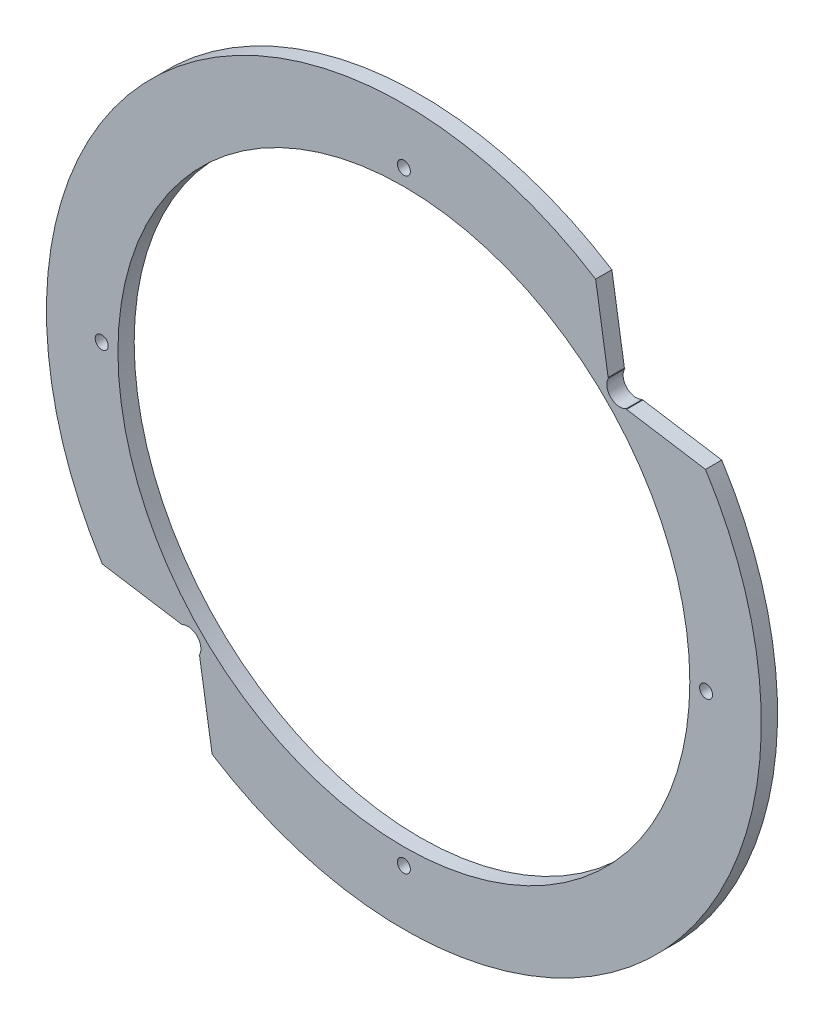
ISO-10303-21;
HEADER;
FILE_DESCRIPTION(('STEP AP214'),'2;1');
FILE_NAME('part.step','',(''),(''),'','','');
FILE_SCHEMA(('AUTOMOTIVE_DESIGN { 1 0 10303 214 1 1 1 1 }'));
ENDSEC;
DATA;
#1=APPLICATION_CONTEXT('core data for automotive mechanical design processes');
#2=APPLICATION_PROTOCOL_DEFINITION('international standard','automotive_design',2000,#1);
#3=PRODUCT_CONTEXT('',#1,'mechanical');
#4=PRODUCT('Part','Part','',(#3));
#5=PRODUCT_RELATED_PRODUCT_CATEGORY('part','',(#4));
#6=PRODUCT_DEFINITION_FORMATION('','',#4);
#7=PRODUCT_DEFINITION_CONTEXT('part definition',#1,'design');
#8=PRODUCT_DEFINITION('design','',#6,#7);
#9=PRODUCT_DEFINITION_SHAPE('','',#8);
#10=(LENGTH_UNIT() NAMED_UNIT(*) SI_UNIT(.MILLI.,.METRE.));
#11=(NAMED_UNIT(*) PLANE_ANGLE_UNIT() SI_UNIT($,.RADIAN.));
#12=(NAMED_UNIT(*) SI_UNIT($,.STERADIAN.) SOLID_ANGLE_UNIT());
#13=UNCERTAINTY_MEASURE_WITH_UNIT(LENGTH_MEASURE(1.E-05),#10,'distance_accuracy_value','');
#14=(GEOMETRIC_REPRESENTATION_CONTEXT(3) GLOBAL_UNCERTAINTY_ASSIGNED_CONTEXT((#13)) GLOBAL_UNIT_ASSIGNED_CONTEXT((#10,
#11,#12)) REPRESENTATION_CONTEXT('',''));
#15=CARTESIAN_POINT('',(0.,0.,0.));
#16=DIRECTION('',(0.,0.,1.));
#17=DIRECTION('',(1.,0.,0.));
#18=AXIS2_PLACEMENT_3D('',#15,#16,#17);
#19=CARTESIAN_POINT('',(-8.54872034122459,-3.36544415628814,3.175));
#20=DIRECTION('',(0.,0.,-1.));
#21=DIRECTION('',(-1.,0.,0.));
#22=AXIS2_PLACEMENT_3D('',#19,#20,#21);
#23=CYLINDRICAL_SURFACE('',#22,69.85);
#24=CARTESIAN_POINT('',(-8.54872034122459,-3.36544415628814,3.175));
#25=DIRECTION('',(0.,0.,1.));
#26=DIRECTION('',(1.,0.,0.));
#27=AXIS2_PLACEMENT_3D('',#24,#25,#26);
#28=CIRCLE('',#27,69.85);
#29=CARTESIAN_POINT('',(-46.0242759515112,-62.3112262929289,3.175));
#30=VERTEX_POINT('',#29);
#31=CARTESIAN_POINT('',(50.3970617954156,34.1101114539994,3.175));
#32=VERTEX_POINT('',#31);
#33=EDGE_CURVE('E44',#30,#32,#28,.T.);
#34=ORIENTED_EDGE('',*,*,#33,.F.);
#35=DIRECTION('',(0.,0.,-1.));
#36=VECTOR('',#35,1.);
#37=CARTESIAN_POINT('',(-46.0242759515112,-62.3112262929289,3.175));
#38=LINE('',#37,#36);
#39=CARTESIAN_POINT('',(-46.0242759515112,-62.3112262929289,0.));
#40=VERTEX_POINT('',#39);
#41=EDGE_CURVE('E166',#30,#40,#38,.T.);
#42=ORIENTED_EDGE('',*,*,#41,.T.);
#43=CARTESIAN_POINT('',(-8.54872034122459,-3.36544415628814,0.));
#44=DIRECTION('',(0.,0.,1.));
#45=DIRECTION('',(1.,0.,0.));
#46=AXIS2_PLACEMENT_3D('',#43,#44,#45);
#47=CIRCLE('',#46,69.85);
#48=CARTESIAN_POINT('',(50.3970617954156,34.1101114539994,0.));
#49=VERTEX_POINT('',#48);
#50=EDGE_CURVE('E60',#40,#49,#47,.T.);
#51=ORIENTED_EDGE('',*,*,#50,.T.);
#52=DIRECTION('',(0.,0.,-1.));
#53=VECTOR('',#52,1.);
#54=CARTESIAN_POINT('',(50.3970617954156,34.1101114539994,3.175));
#55=LINE('',#54,#53);
#56=EDGE_CURVE('E154',#32,#49,#55,.T.);
#57=ORIENTED_EDGE('',*,*,#56,.F.);
#58=EDGE_LOOP('',(#34,#42,#51,#57));
#59=FACE_BOUND('',#58,.T.);
#60=ADVANCED_FACE('F35',(#59),#23,.T.);
#61=CARTESIAN_POINT('',(-8.54872034122459,-3.36544415628814,3.175));
#62=DIRECTION('',(0.,0.,-1.));
#63=DIRECTION('',(-1.,0.,0.));
#64=AXIS2_PLACEMENT_3D('',#61,#62,#63);
#65=CYLINDRICAL_SURFACE('',#64,55.88);
#66=CARTESIAN_POINT('',(-8.54872034122459,-3.36544415628814,3.175));
#67=DIRECTION('',(0.,0.,1.));
#68=DIRECTION('',(1.,0.,0.));
#69=AXIS2_PLACEMENT_3D('',#66,#67,#68);
#70=CIRCLE('',#69,55.88);
#71=CARTESIAN_POINT('',(47.3312796587754,-3.36544415628814,3.175));
#72=VERTEX_POINT('',#71);
#73=EDGE_CURVE('E212',#72,#72,#70,.T.);
#74=ORIENTED_EDGE('',*,*,#73,.T.);
#75=EDGE_LOOP('',(#74));
#76=FACE_BOUND('',#75,.T.);
#77=CARTESIAN_POINT('',(-8.54872034122459,-3.36544415628814,0.));
#78=DIRECTION('',(0.,0.,1.));
#79=DIRECTION('',(1.,0.,0.));
#80=AXIS2_PLACEMENT_3D('',#77,#78,#79);
#81=CIRCLE('',#80,55.88);
#82=CARTESIAN_POINT('',(47.3312796587754,-3.36544415628814,0.));
#83=VERTEX_POINT('',#82);
#84=EDGE_CURVE('E209',#83,#83,#81,.T.);
#85=ORIENTED_EDGE('',*,*,#84,.F.);
#86=EDGE_LOOP('',(#85));
#87=FACE_BOUND('',#86,.T.);
#88=ADVANCED_FACE('F37',(#76,#87),#65,.F.);
#89=CARTESIAN_POINT('',(28.9268352690623,55.5803379803524,0.));
#90=VERTEX_POINT('',#89);
#91=CARTESIAN_POINT('',(-67.4945024778652,-40.840999766575,0.));
#92=VERTEX_POINT('',#91);
#93=EDGE_CURVE('E39',#90,#92,#47,.T.);
#94=ORIENTED_EDGE('',*,*,#93,.T.);
#95=DIRECTION('',(0.,0.,-1.));
#96=VECTOR('',#95,1.);
#97=CARTESIAN_POINT('',(-67.4945024778652,-40.840999766575,3.175));
#98=LINE('',#97,#96);
#99=CARTESIAN_POINT('',(-67.4945024778652,-40.840999766575,3.175));
#100=VERTEX_POINT('',#99);
#101=EDGE_CURVE('E52',#100,#92,#98,.T.);
#102=ORIENTED_EDGE('',*,*,#101,.F.);
#103=CARTESIAN_POINT('',(28.9268352690623,55.5803379803524,3.175));
#104=VERTEX_POINT('',#103);
#105=EDGE_CURVE('E11',#104,#100,#28,.T.);
#106=ORIENTED_EDGE('',*,*,#105,.F.);
#107=DIRECTION('',(0.,0.,-1.));
#108=VECTOR('',#107,1.);
#109=CARTESIAN_POINT('',(28.9268352690623,55.5803379803524,3.175));
#110=LINE('',#109,#108);
#111=EDGE_CURVE('E178',#104,#90,#110,.T.);
#112=ORIENTED_EDGE('',*,*,#111,.T.);
#113=EDGE_LOOP('',(#94,#102,#106,#112));
#114=FACE_BOUND('',#113,.T.);
#115=ADVANCED_FACE('F139',(#114),#23,.T.);
#116=CARTESIAN_POINT('',(0.,0.,3.175));
#117=DIRECTION('',(0.,0.,1.));
#118=DIRECTION('',(1.,0.,0.));
#119=AXIS2_PLACEMENT_3D('',#116,#117,#118);
#120=PLANE('',#119);
#121=DIRECTION('',(0.156434465040236,-0.987688340595137,0.));
#122=VECTOR('',#121,1.);
#123=CARTESIAN_POINT('',(-54.5255956839104,-8.6360059557584,3.175));
#124=LINE('',#123,#122);
#125=CARTESIAN_POINT('',(-48.4674898991949,-46.8853805300659,3.175));
#126=VERTEX_POINT('',#125);
#127=EDGE_CURVE('E142',#126,#30,#124,.T.);
#128=ORIENTED_EDGE('',*,*,#127,.T.);
#129=ORIENTED_EDGE('',*,*,#33,.T.);
#130=DIRECTION('',(-0.987688340595139,0.156434465040225,0.));
#131=VECTOR('',#130,1.);
#132=CARTESIAN_POINT('',(6.50360594603244,41.0621518926134,3.175));
#133=LINE('',#132,#131);
#134=CARTESIAN_POINT('',(34.9712160325524,36.553325401683,3.175));
#135=VERTEX_POINT('',#134);
#136=EDGE_CURVE('E177',#32,#135,#133,.T.);
#137=ORIENTED_EDGE('',*,*,#136,.T.);
#138=CARTESIAN_POINT('',(-8.54872034122459,-3.36544415628814,3.175));
#139=DIRECTION('',(0.,0.,-1.));
#140=DIRECTION('',(-1.,0.,0.));
#141=AXIS2_PLACEMENT_3D('',#138,#139,#140);
#142=CIRCLE('',#141,59.055);
#143=CARTESIAN_POINT('',(34.9030183787262,36.6275480700149,3.175));
#144=VERTEX_POINT('',#143);
#145=EDGE_CURVE('E306',#144,#135,#142,.T.);
#146=ORIENTED_EDGE('',*,*,#145,.F.);
#147=CARTESIAN_POINT('',(33.6584834278004,38.8417596127373,3.175));
#148=DIRECTION('',(0.,0.,-1.));
#149=DIRECTION('',(-1.,0.,0.));
#150=AXIS2_PLACEMENT_3D('',#147,#148,#149);
#151=CIRCLE('',#150,2.54000000000013);
#152=CARTESIAN_POINT('',(31.444271885078,40.086294563663,3.175));
#153=VERTEX_POINT('',#152);
#154=EDGE_CURVE('E158',#144,#153,#151,.T.);
#155=ORIENTED_EDGE('',*,*,#154,.T.);
#156=CARTESIAN_POINT('',(-8.54872034122459,-3.36544415628814,3.175));
#157=DIRECTION('',(0.,0.,-1.));
#158=DIRECTION('',(-1.,0.,0.));
#159=AXIS2_PLACEMENT_3D('',#156,#157,#158);
#160=CIRCLE('',#159,59.055);
#161=CARTESIAN_POINT('',(31.3700492167461,40.1544922174892,3.175));
#162=VERTEX_POINT('',#161);
#163=EDGE_CURVE('E152',#162,#153,#160,.T.);
#164=ORIENTED_EDGE('',*,*,#163,.F.);
#165=DIRECTION('',(-0.156434465040236,0.987688340595137,0.));
#166=VECTOR('',#165,1.);
#167=CARTESIAN_POINT('',(36.8065797182666,5.82958952893829,3.175));
#168=LINE('',#167,#166);
#169=EDGE_CURVE('E150',#162,#104,#168,.T.);
#170=ORIENTED_EDGE('',*,*,#169,.T.);
#171=ORIENTED_EDGE('',*,*,#105,.T.);
#172=DIRECTION('',(0.987688340595139,-0.156434465040226,0.));
#173=VECTOR('',#172,1.);
#174=CARTESIAN_POINT('',(-7.96198953866322,-50.2700235095634,3.175));
#175=LINE('',#174,#173);
#176=CARTESIAN_POINT('',(-52.0686567150023,-43.2842137142585,3.175));
#177=VERTEX_POINT('',#176);
#178=EDGE_CURVE('E128',#100,#177,#175,.T.);
#179=ORIENTED_EDGE('',*,*,#178,.T.);
#180=CARTESIAN_POINT('',(-8.54872034122459,-3.36544415628814,3.175));
#181=DIRECTION('',(0.,0.,-1.));
#182=DIRECTION('',(-1.,0.,0.));
#183=AXIS2_PLACEMENT_3D('',#180,#181,#182);
#184=CIRCLE('',#183,59.055);
#185=CARTESIAN_POINT('',(-52.0004590611755,-43.358436382591,3.175));
#186=VERTEX_POINT('',#185);
#187=EDGE_CURVE('E133',#186,#177,#184,.T.);
#188=ORIENTED_EDGE('',*,*,#187,.F.);
#189=CARTESIAN_POINT('',(-50.7559241102495,-45.5726479253132,3.175));
#190=DIRECTION('',(0.,0.,-1.));
#191=DIRECTION('',(-1.,0.,0.));
#192=AXIS2_PLACEMENT_3D('',#189,#190,#191);
#193=CIRCLE('',#192,2.54);
#194=CARTESIAN_POINT('',(-48.5417125675273,-46.8171828762392,3.175));
#195=VERTEX_POINT('',#194);
#196=EDGE_CURVE('E334',#186,#195,#193,.T.);
#197=ORIENTED_EDGE('',*,*,#196,.T.);
#198=CARTESIAN_POINT('',(-8.54872034122459,-3.36544415628814,3.175));
#199=DIRECTION('',(0.,0.,-1.));
#200=DIRECTION('',(-1.,0.,0.));
#201=AXIS2_PLACEMENT_3D('',#198,#199,#200);
#202=CIRCLE('',#201,59.055);
#203=EDGE_CURVE('E336',#126,#195,#202,.T.);
#204=ORIENTED_EDGE('',*,*,#203,.F.);
#205=EDGE_LOOP('',(#128,#129,#137,#146,#155,#164,#170,#171,#179,#188,#197,#204));
#206=FACE_BOUND('',#205,.T.);
#207=CARTESIAN_POINT('',(-67.6037203412246,-3.36544415628814,3.175));
#208=DIRECTION('',(0.,0.,-1.));
#209=DIRECTION('',(-1.,0.,0.));
#210=AXIS2_PLACEMENT_3D('',#207,#208,#209);
#211=CIRCLE('',#210,1.26999999999999);
#212=CARTESIAN_POINT('',(-68.8737203412246,-3.36544415628814,3.175));
#213=VERTEX_POINT('',#212);
#214=EDGE_CURVE('E188',#213,#213,#211,.T.);
#215=ORIENTED_EDGE('',*,*,#214,.T.);
#216=EDGE_LOOP('',(#215));
#217=FACE_BOUND('',#216,.T.);
#218=CARTESIAN_POINT('',(-8.5487203412246,-62.4204441562881,3.175));
#219=DIRECTION('',(0.,0.,-1.));
#220=DIRECTION('',(-1.,0.,0.));
#221=AXIS2_PLACEMENT_3D('',#218,#219,#220);
#222=CIRCLE('',#221,1.27);
#223=CARTESIAN_POINT('',(-9.8187203412246,-62.4204441562881,3.175));
#224=VERTEX_POINT('',#223);
#225=EDGE_CURVE('E194',#224,#224,#222,.T.);
#226=ORIENTED_EDGE('',*,*,#225,.T.);
#227=EDGE_LOOP('',(#226));
#228=FACE_BOUND('',#227,.T.);
#229=CARTESIAN_POINT('',(50.5062796587754,-3.36544415628814,3.175));
#230=DIRECTION('',(0.,0.,-1.));
#231=DIRECTION('',(-1.,0.,0.));
#232=AXIS2_PLACEMENT_3D('',#229,#230,#231);
#233=CIRCLE('',#232,1.27);
#234=CARTESIAN_POINT('',(49.2362796587754,-3.36544415628814,3.175));
#235=VERTEX_POINT('',#234);
#236=EDGE_CURVE('E200',#235,#235,#233,.T.);
#237=ORIENTED_EDGE('',*,*,#236,.T.);
#238=EDGE_LOOP('',(#237));
#239=FACE_BOUND('',#238,.T.);
#240=CARTESIAN_POINT('',(-8.5487203412246,55.6895558437119,3.175));
#241=DIRECTION('',(0.,0.,-1.));
#242=DIRECTION('',(-1.,0.,0.));
#243=AXIS2_PLACEMENT_3D('',#240,#241,#242);
#244=CIRCLE('',#243,1.27);
#245=CARTESIAN_POINT('',(-9.8187203412246,55.6895558437119,3.175));
#246=VERTEX_POINT('',#245);
#247=EDGE_CURVE('E206',#246,#246,#244,.T.);
#248=ORIENTED_EDGE('',*,*,#247,.T.);
#249=EDGE_LOOP('',(#248));
#250=FACE_BOUND('',#249,.T.);
#251=ORIENTED_EDGE('',*,*,#73,.F.);
#252=EDGE_LOOP('',(#251));
#253=FACE_BOUND('',#252,.T.);
#254=ADVANCED_FACE('F146',(#206,#217,#228,#239,#250,#253),#120,.T.);
#255=CARTESIAN_POINT('',(0.,0.,0.));
#256=DIRECTION('',(0.,0.,1.));
#257=DIRECTION('',(1.,0.,0.));
#258=AXIS2_PLACEMENT_3D('',#255,#256,#257);
#259=PLANE('',#258);
#260=CARTESIAN_POINT('',(-67.6037203412246,-3.36544415628814,0.));
#261=DIRECTION('',(0.,0.,-1.));
#262=DIRECTION('',(-1.,0.,0.));
#263=AXIS2_PLACEMENT_3D('',#260,#261,#262);
#264=CIRCLE('',#263,1.26999999999999);
#265=CARTESIAN_POINT('',(-68.8737203412246,-3.36544415628814,0.));
#266=VERTEX_POINT('',#265);
#267=EDGE_CURVE('E180',#266,#266,#264,.T.);
#268=ORIENTED_EDGE('',*,*,#267,.F.);
#269=EDGE_LOOP('',(#268));
#270=FACE_BOUND('',#269,.T.);
#271=CARTESIAN_POINT('',(-8.5487203412246,-62.4204441562881,0.));
#272=DIRECTION('',(0.,0.,-1.));
#273=DIRECTION('',(-1.,0.,0.));
#274=AXIS2_PLACEMENT_3D('',#271,#272,#273);
#275=CIRCLE('',#274,1.27);
#276=CARTESIAN_POINT('',(-9.8187203412246,-62.4204441562881,0.));
#277=VERTEX_POINT('',#276);
#278=EDGE_CURVE('E191',#277,#277,#275,.T.);
#279=ORIENTED_EDGE('',*,*,#278,.F.);
#280=EDGE_LOOP('',(#279));
#281=FACE_BOUND('',#280,.T.);
#282=CARTESIAN_POINT('',(50.5062796587754,-3.36544415628814,0.));
#283=DIRECTION('',(0.,0.,-1.));
#284=DIRECTION('',(-1.,0.,0.));
#285=AXIS2_PLACEMENT_3D('',#282,#283,#284);
#286=CIRCLE('',#285,1.27);
#287=CARTESIAN_POINT('',(49.2362796587754,-3.36544415628814,0.));
#288=VERTEX_POINT('',#287);
#289=EDGE_CURVE('E197',#288,#288,#286,.T.);
#290=ORIENTED_EDGE('',*,*,#289,.F.);
#291=EDGE_LOOP('',(#290));
#292=FACE_BOUND('',#291,.T.);
#293=CARTESIAN_POINT('',(-8.5487203412246,55.6895558437119,0.));
#294=DIRECTION('',(0.,0.,-1.));
#295=DIRECTION('',(-1.,0.,0.));
#296=AXIS2_PLACEMENT_3D('',#293,#294,#295);
#297=CIRCLE('',#296,1.27);
#298=CARTESIAN_POINT('',(-9.8187203412246,55.6895558437119,0.));
#299=VERTEX_POINT('',#298);
#300=EDGE_CURVE('E203',#299,#299,#297,.T.);
#301=ORIENTED_EDGE('',*,*,#300,.F.);
#302=EDGE_LOOP('',(#301));
#303=FACE_BOUND('',#302,.T.);
#304=ORIENTED_EDGE('',*,*,#84,.T.);
#305=EDGE_LOOP('',(#304));
#306=FACE_BOUND('',#305,.T.);
#307=ORIENTED_EDGE('',*,*,#50,.F.);
#308=DIRECTION('',(0.156434465040236,-0.987688340595137,0.));
#309=VECTOR('',#308,1.);
#310=CARTESIAN_POINT('',(-54.5255956839104,-8.6360059557584,0.));
#311=LINE('',#310,#309);
#312=CARTESIAN_POINT('',(-48.4674898991949,-46.8853805300659,0.));
#313=VERTEX_POINT('',#312);
#314=EDGE_CURVE('E134',#313,#40,#311,.T.);
#315=ORIENTED_EDGE('',*,*,#314,.F.);
#316=CARTESIAN_POINT('',(-8.54872034122459,-3.36544415628814,0.));
#317=DIRECTION('',(0.,0.,-1.));
#318=DIRECTION('',(-1.,0.,0.));
#319=AXIS2_PLACEMENT_3D('',#316,#317,#318);
#320=CIRCLE('',#319,59.055);
#321=CARTESIAN_POINT('',(-48.5417125675273,-46.8171828762392,0.));
#322=VERTEX_POINT('',#321);
#323=EDGE_CURVE('E295',#313,#322,#320,.T.);
#324=ORIENTED_EDGE('',*,*,#323,.T.);
#325=CARTESIAN_POINT('',(-50.7559241102495,-45.5726479253132,0.));
#326=DIRECTION('',(0.,0.,-1.));
#327=DIRECTION('',(-1.,0.,0.));
#328=AXIS2_PLACEMENT_3D('',#325,#326,#327);
#329=CIRCLE('',#328,2.54);
#330=CARTESIAN_POINT('',(-52.0004590611755,-43.358436382591,0.));
#331=VERTEX_POINT('',#330);
#332=EDGE_CURVE('E320',#331,#322,#329,.T.);
#333=ORIENTED_EDGE('',*,*,#332,.F.);
#334=CARTESIAN_POINT('',(-8.54872034122459,-3.36544415628814,0.));
#335=DIRECTION('',(0.,0.,-1.));
#336=DIRECTION('',(-1.,0.,0.));
#337=AXIS2_PLACEMENT_3D('',#334,#335,#336);
#338=CIRCLE('',#337,59.055);
#339=CARTESIAN_POINT('',(-52.0686567150023,-43.2842137142585,0.));
#340=VERTEX_POINT('',#339);
#341=EDGE_CURVE('E318',#331,#340,#338,.T.);
#342=ORIENTED_EDGE('',*,*,#341,.T.);
#343=DIRECTION('',(0.987688340595139,-0.156434465040226,0.));
#344=VECTOR('',#343,1.);
#345=CARTESIAN_POINT('',(-7.96198953866322,-50.2700235095634,0.));
#346=LINE('',#345,#344);
#347=EDGE_CURVE('E315',#92,#340,#346,.T.);
#348=ORIENTED_EDGE('',*,*,#347,.F.);
#349=ORIENTED_EDGE('',*,*,#93,.F.);
#350=DIRECTION('',(-0.156434465040236,0.987688340595137,0.));
#351=VECTOR('',#350,1.);
#352=CARTESIAN_POINT('',(36.8065797182666,5.82958952893829,0.));
#353=LINE('',#352,#351);
#354=CARTESIAN_POINT('',(31.3700492167461,40.1544922174892,0.));
#355=VERTEX_POINT('',#354);
#356=EDGE_CURVE('E175',#355,#90,#353,.T.);
#357=ORIENTED_EDGE('',*,*,#356,.F.);
#358=CARTESIAN_POINT('',(-8.54872034122459,-3.36544415628814,0.));
#359=DIRECTION('',(0.,0.,-1.));
#360=DIRECTION('',(-1.,0.,0.));
#361=AXIS2_PLACEMENT_3D('',#358,#359,#360);
#362=CIRCLE('',#361,59.055);
#363=CARTESIAN_POINT('',(31.444271885078,40.086294563663,0.));
#364=VERTEX_POINT('',#363);
#365=EDGE_CURVE('E172',#355,#364,#362,.T.);
#366=ORIENTED_EDGE('',*,*,#365,.T.);
#367=CARTESIAN_POINT('',(33.6584834278004,38.8417596127373,0.));
#368=DIRECTION('',(0.,0.,-1.));
#369=DIRECTION('',(-1.,0.,0.));
#370=AXIS2_PLACEMENT_3D('',#367,#368,#369);
#371=CIRCLE('',#370,2.54000000000013);
#372=CARTESIAN_POINT('',(34.9030183787262,36.6275480700149,0.));
#373=VERTEX_POINT('',#372);
#374=EDGE_CURVE('E169',#373,#364,#371,.T.);
#375=ORIENTED_EDGE('',*,*,#374,.F.);
#376=CARTESIAN_POINT('',(-8.54872034122459,-3.36544415628814,0.));
#377=DIRECTION('',(0.,0.,-1.));
#378=DIRECTION('',(-1.,0.,0.));
#379=AXIS2_PLACEMENT_3D('',#376,#377,#378);
#380=CIRCLE('',#379,59.055);
#381=CARTESIAN_POINT('',(34.9712160325524,36.553325401683,0.));
#382=VERTEX_POINT('',#381);
#383=EDGE_CURVE('E165',#373,#382,#380,.T.);
#384=ORIENTED_EDGE('',*,*,#383,.T.);
#385=DIRECTION('',(-0.987688340595139,0.156434465040225,0.));
#386=VECTOR('',#385,1.);
#387=CARTESIAN_POINT('',(6.50360594603244,41.0621518926134,0.));
#388=LINE('',#387,#386);
#389=EDGE_CURVE('E162',#49,#382,#388,.T.);
#390=ORIENTED_EDGE('',*,*,#389,.F.);
#391=EDGE_LOOP('',(#307,#315,#324,#333,#342,#348,#349,#357,#366,#375,#384,#390));
#392=FACE_BOUND('',#391,.T.);
#393=ADVANCED_FACE('F217',(#270,#281,#292,#303,#306,#392),#259,.F.);
#394=CARTESIAN_POINT('',(-8.5487203412246,55.6895558437119,3.175));
#395=DIRECTION('',(0.,0.,-1.));
#396=DIRECTION('',(-1.,0.,0.));
#397=AXIS2_PLACEMENT_3D('',#394,#395,#396);
#398=CYLINDRICAL_SURFACE('',#397,1.27);
#399=ORIENTED_EDGE('',*,*,#247,.F.);
#400=EDGE_LOOP('',(#399));
#401=FACE_BOUND('',#400,.T.);
#402=ORIENTED_EDGE('',*,*,#300,.T.);
#403=EDGE_LOOP('',(#402));
#404=FACE_BOUND('',#403,.T.);
#405=ADVANCED_FACE('F233',(#401,#404),#398,.F.);
#406=CARTESIAN_POINT('',(50.5062796587754,-3.36544415628814,3.175));
#407=DIRECTION('',(0.,0.,-1.));
#408=DIRECTION('',(-1.,0.,0.));
#409=AXIS2_PLACEMENT_3D('',#406,#407,#408);
#410=CYLINDRICAL_SURFACE('',#409,1.27);
#411=ORIENTED_EDGE('',*,*,#236,.F.);
#412=EDGE_LOOP('',(#411));
#413=FACE_BOUND('',#412,.T.);
#414=ORIENTED_EDGE('',*,*,#289,.T.);
#415=EDGE_LOOP('',(#414));
#416=FACE_BOUND('',#415,.T.);
#417=ADVANCED_FACE('F239',(#413,#416),#410,.F.);
#418=CARTESIAN_POINT('',(-8.5487203412246,-62.4204441562881,3.175));
#419=DIRECTION('',(0.,0.,-1.));
#420=DIRECTION('',(-1.,0.,0.));
#421=AXIS2_PLACEMENT_3D('',#418,#419,#420);
#422=CYLINDRICAL_SURFACE('',#421,1.27);
#423=ORIENTED_EDGE('',*,*,#225,.F.);
#424=EDGE_LOOP('',(#423));
#425=FACE_BOUND('',#424,.T.);
#426=ORIENTED_EDGE('',*,*,#278,.T.);
#427=EDGE_LOOP('',(#426));
#428=FACE_BOUND('',#427,.T.);
#429=ADVANCED_FACE('F243',(#425,#428),#422,.F.);
#430=CARTESIAN_POINT('',(-67.6037203412246,-3.36544415628814,3.175));
#431=DIRECTION('',(0.,0.,-1.));
#432=DIRECTION('',(-1.,0.,0.));
#433=AXIS2_PLACEMENT_3D('',#430,#431,#432);
#434=CYLINDRICAL_SURFACE('',#433,1.26999999999999);
#435=ORIENTED_EDGE('',*,*,#214,.F.);
#436=EDGE_LOOP('',(#435));
#437=FACE_BOUND('',#436,.T.);
#438=ORIENTED_EDGE('',*,*,#267,.T.);
#439=EDGE_LOOP('',(#438));
#440=FACE_BOUND('',#439,.T.);
#441=ADVANCED_FACE('F247',(#437,#440),#434,.F.);
#442=CARTESIAN_POINT('',(36.8065797182666,5.82958952893829,3.175));
#443=DIRECTION('',(-0.987688340595137,-0.156434465040236,0.));
#444=DIRECTION('',(0.156434465040236,-0.987688340595137,0.));
#445=AXIS2_PLACEMENT_3D('',#442,#443,#444);
#446=PLANE('',#445);
#447=ORIENTED_EDGE('',*,*,#356,.T.);
#448=ORIENTED_EDGE('',*,*,#111,.F.);
#449=ORIENTED_EDGE('',*,*,#169,.F.);
#450=DIRECTION('',(0.,0.,-1.));
#451=VECTOR('',#450,1.);
#452=CARTESIAN_POINT('',(31.3700492167461,40.1544922174892,3.175));
#453=LINE('',#452,#451);
#454=EDGE_CURVE('E181',#162,#355,#453,.T.);
#455=ORIENTED_EDGE('',*,*,#454,.T.);
#456=EDGE_LOOP('',(#447,#448,#449,#455));
#457=FACE_BOUND('',#456,.T.);
#458=ADVANCED_FACE('F251',(#457),#446,.F.);
#459=CARTESIAN_POINT('',(-8.54872034122459,-3.36544415628814,3.175));
#460=DIRECTION('',(0.,0.,-1.));
#461=DIRECTION('',(-1.,0.,0.));
#462=AXIS2_PLACEMENT_3D('',#459,#460,#461);
#463=CYLINDRICAL_SURFACE('',#462,59.055);
#464=ORIENTED_EDGE('',*,*,#365,.F.);
#465=ORIENTED_EDGE('',*,*,#454,.F.);
#466=ORIENTED_EDGE('',*,*,#163,.T.);
#467=DIRECTION('',(0.,0.,-1.));
#468=VECTOR('',#467,1.);
#469=CARTESIAN_POINT('',(31.444271885078,40.086294563663,3.175));
#470=LINE('',#469,#468);
#471=EDGE_CURVE('E183',#153,#364,#470,.T.);
#472=ORIENTED_EDGE('',*,*,#471,.T.);
#473=EDGE_LOOP('',(#464,#465,#466,#472));
#474=FACE_BOUND('',#473,.T.);
#475=ADVANCED_FACE('F265',(#474),#463,.T.);
#476=CARTESIAN_POINT('',(33.6584834278004,38.8417596127373,3.175));
#477=DIRECTION('',(0.,0.,-1.));
#478=DIRECTION('',(-1.,0.,0.));
#479=AXIS2_PLACEMENT_3D('',#476,#477,#478);
#480=CYLINDRICAL_SURFACE('',#479,2.54000000000013);
#481=ORIENTED_EDGE('',*,*,#374,.T.);
#482=ORIENTED_EDGE('',*,*,#471,.F.);
#483=ORIENTED_EDGE('',*,*,#154,.F.);
#484=DIRECTION('',(0.,0.,-1.));
#485=VECTOR('',#484,1.);
#486=CARTESIAN_POINT('',(34.9030183787262,36.6275480700149,3.175));
#487=LINE('',#486,#485);
#488=EDGE_CURVE('E185',#144,#373,#487,.T.);
#489=ORIENTED_EDGE('',*,*,#488,.T.);
#490=EDGE_LOOP('',(#481,#482,#483,#489));
#491=FACE_BOUND('',#490,.T.);
#492=ADVANCED_FACE('F261',(#491),#480,.F.);
#493=CARTESIAN_POINT('',(-8.54872034122459,-3.36544415628814,3.175));
#494=DIRECTION('',(0.,0.,-1.));
#495=DIRECTION('',(-1.,0.,0.));
#496=AXIS2_PLACEMENT_3D('',#493,#494,#495);
#497=CYLINDRICAL_SURFACE('',#496,59.055);
#498=ORIENTED_EDGE('',*,*,#383,.F.);
#499=ORIENTED_EDGE('',*,*,#488,.F.);
#500=ORIENTED_EDGE('',*,*,#145,.T.);
#501=DIRECTION('',(0.,0.,-1.));
#502=VECTOR('',#501,1.);
#503=CARTESIAN_POINT('',(34.9712160325524,36.553325401683,3.175));
#504=LINE('',#503,#502);
#505=EDGE_CURVE('E156',#135,#382,#504,.T.);
#506=ORIENTED_EDGE('',*,*,#505,.T.);
#507=EDGE_LOOP('',(#498,#499,#500,#506));
#508=FACE_BOUND('',#507,.T.);
#509=ADVANCED_FACE('F257',(#508),#497,.T.);
#510=CARTESIAN_POINT('',(6.50360594603244,41.0621518926134,3.175));
#511=DIRECTION('',(-0.156434465040225,-0.987688340595139,0.));
#512=DIRECTION('',(0.987688340595139,-0.156434465040225,0.));
#513=AXIS2_PLACEMENT_3D('',#510,#511,#512);
#514=PLANE('',#513);
#515=ORIENTED_EDGE('',*,*,#389,.T.);
#516=ORIENTED_EDGE('',*,*,#505,.F.);
#517=ORIENTED_EDGE('',*,*,#136,.F.);
#518=ORIENTED_EDGE('',*,*,#56,.T.);
#519=EDGE_LOOP('',(#515,#516,#517,#518));
#520=FACE_BOUND('',#519,.T.);
#521=ADVANCED_FACE('F253',(#520),#514,.F.);
#522=CARTESIAN_POINT('',(-54.5255956839104,-8.6360059557584,3.175));
#523=DIRECTION('',(0.987688340595137,0.156434465040236,0.));
#524=DIRECTION('',(-0.156434465040236,0.987688340595137,0.));
#525=AXIS2_PLACEMENT_3D('',#522,#523,#524);
#526=PLANE('',#525);
#527=ORIENTED_EDGE('',*,*,#314,.T.);
#528=ORIENTED_EDGE('',*,*,#41,.F.);
#529=ORIENTED_EDGE('',*,*,#127,.F.);
#530=DIRECTION('',(0.,0.,-1.));
#531=VECTOR('',#530,1.);
#532=CARTESIAN_POINT('',(-48.4674898991949,-46.8853805300659,3.175));
#533=LINE('',#532,#531);
#534=EDGE_CURVE('E292',#126,#313,#533,.T.);
#535=ORIENTED_EDGE('',*,*,#534,.T.);
#536=EDGE_LOOP('',(#527,#528,#529,#535));
#537=FACE_BOUND('',#536,.T.);
#538=ADVANCED_FACE('F256',(#537),#526,.F.);
#539=CARTESIAN_POINT('',(-8.54872034122459,-3.36544415628814,3.175));
#540=DIRECTION('',(0.,0.,-1.));
#541=DIRECTION('',(-1.,0.,0.));
#542=AXIS2_PLACEMENT_3D('',#539,#540,#541);
#543=CYLINDRICAL_SURFACE('',#542,59.055);
#544=ORIENTED_EDGE('',*,*,#323,.F.);
#545=ORIENTED_EDGE('',*,*,#534,.F.);
#546=ORIENTED_EDGE('',*,*,#203,.T.);
#547=DIRECTION('',(0.,0.,-1.));
#548=VECTOR('',#547,1.);
#549=CARTESIAN_POINT('',(-48.5417125675273,-46.8171828762392,3.175));
#550=LINE('',#549,#548);
#551=EDGE_CURVE('E329',#195,#322,#550,.T.);
#552=ORIENTED_EDGE('',*,*,#551,.T.);
#553=EDGE_LOOP('',(#544,#545,#546,#552));
#554=FACE_BOUND('',#553,.T.);
#555=ADVANCED_FACE('F281',(#554),#543,.T.);
#556=CARTESIAN_POINT('',(-50.7559241102495,-45.5726479253132,3.175));
#557=DIRECTION('',(0.,0.,-1.));
#558=DIRECTION('',(-1.,0.,0.));
#559=AXIS2_PLACEMENT_3D('',#556,#557,#558);
#560=CYLINDRICAL_SURFACE('',#559,2.54);
#561=ORIENTED_EDGE('',*,*,#332,.T.);
#562=ORIENTED_EDGE('',*,*,#551,.F.);
#563=ORIENTED_EDGE('',*,*,#196,.F.);
#564=DIRECTION('',(0.,0.,-1.));
#565=VECTOR('',#564,1.);
#566=CARTESIAN_POINT('',(-52.0004590611755,-43.358436382591,3.175));
#567=LINE('',#566,#565);
#568=EDGE_CURVE('E331',#186,#331,#567,.T.);
#569=ORIENTED_EDGE('',*,*,#568,.T.);
#570=EDGE_LOOP('',(#561,#562,#563,#569));
#571=FACE_BOUND('',#570,.T.);
#572=ADVANCED_FACE('F277',(#571),#560,.F.);
#573=CARTESIAN_POINT('',(-8.54872034122459,-3.36544415628814,3.175));
#574=DIRECTION('',(0.,0.,-1.));
#575=DIRECTION('',(-1.,0.,0.));
#576=AXIS2_PLACEMENT_3D('',#573,#574,#575);
#577=CYLINDRICAL_SURFACE('',#576,59.055);
#578=ORIENTED_EDGE('',*,*,#341,.F.);
#579=ORIENTED_EDGE('',*,*,#568,.F.);
#580=ORIENTED_EDGE('',*,*,#187,.T.);
#581=DIRECTION('',(0.,0.,-1.));
#582=VECTOR('',#581,1.);
#583=CARTESIAN_POINT('',(-52.0686567150023,-43.2842137142585,3.175));
#584=LINE('',#583,#582);
#585=EDGE_CURVE('E130',#177,#340,#584,.T.);
#586=ORIENTED_EDGE('',*,*,#585,.T.);
#587=EDGE_LOOP('',(#578,#579,#580,#586));
#588=FACE_BOUND('',#587,.T.);
#589=ADVANCED_FACE('F274',(#588),#577,.T.);
#590=CARTESIAN_POINT('',(-7.96198953866322,-50.2700235095634,3.175));
#591=DIRECTION('',(0.156434465040226,0.987688340595138,0.));
#592=DIRECTION('',(-0.987688340595139,0.156434465040226,0.));
#593=AXIS2_PLACEMENT_3D('',#590,#591,#592);
#594=PLANE('',#593);
#595=ORIENTED_EDGE('',*,*,#347,.T.);
#596=ORIENTED_EDGE('',*,*,#585,.F.);
#597=ORIENTED_EDGE('',*,*,#178,.F.);
#598=ORIENTED_EDGE('',*,*,#101,.T.);
#599=EDGE_LOOP('',(#595,#596,#597,#598));
#600=FACE_BOUND('',#599,.T.);
#601=ADVANCED_FACE('F129',(#600),#594,.F.);
#602=CLOSED_SHELL('',(#60,#88,#115,#254,#393,#405,#417,#429,#441,#458,#475,#492,#509,#521,#538,
#555,#572,#589,#601));
#603=MANIFOLD_SOLID_BREP('B2',#602);
#604=ADVANCED_BREP_SHAPE_REPRESENTATION('',(#18,#603),#14);
#605=SHAPE_DEFINITION_REPRESENTATION(#9,#604);
ENDSEC;
END-ISO-10303-21;
